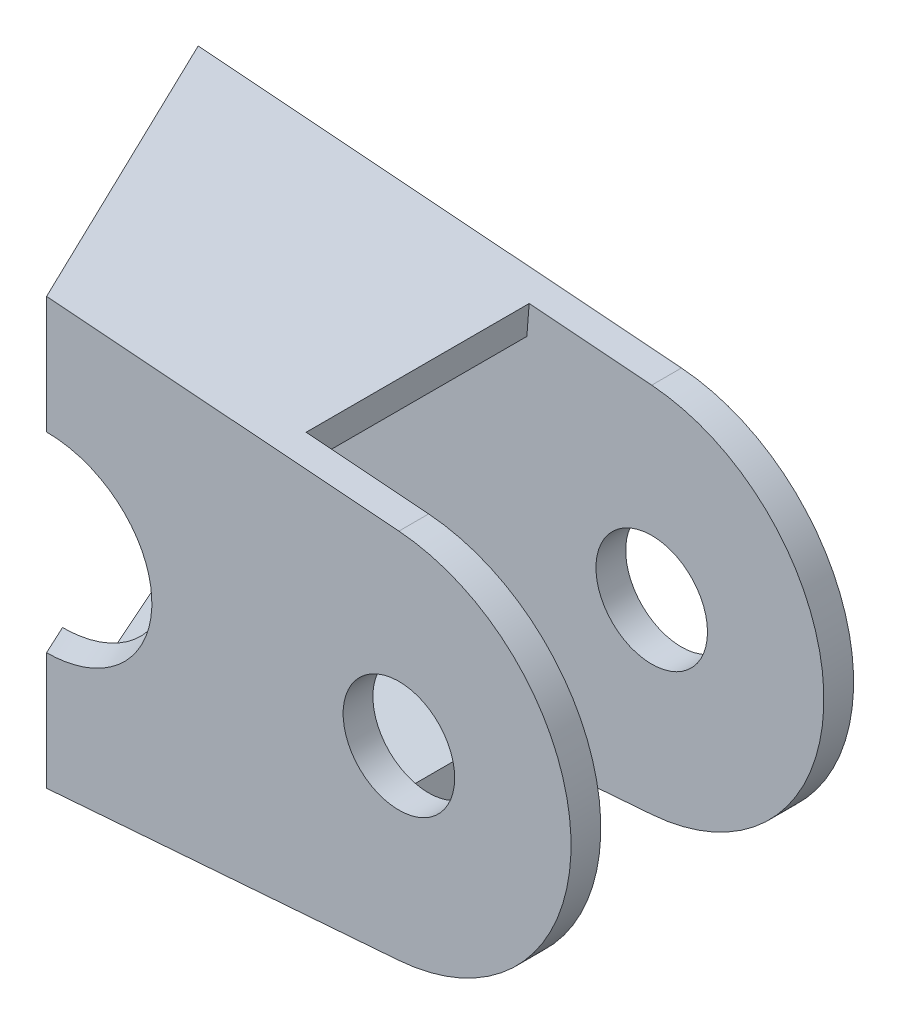
ISO-10303-21;
HEADER;
FILE_DESCRIPTION(('STEP AP214'),'2;1');
FILE_NAME('part.step','',(''),(''),'','','');
FILE_SCHEMA(('AUTOMOTIVE_DESIGN { 1 0 10303 214 1 1 1 1 }'));
ENDSEC;
DATA;
#1=APPLICATION_CONTEXT('core data for automotive mechanical design processes');
#2=APPLICATION_PROTOCOL_DEFINITION('international standard','automotive_design',2000,#1);
#3=PRODUCT_CONTEXT('',#1,'mechanical');
#4=PRODUCT('Part','Part','',(#3));
#5=PRODUCT_RELATED_PRODUCT_CATEGORY('part','',(#4));
#6=PRODUCT_DEFINITION_FORMATION('','',#4);
#7=PRODUCT_DEFINITION_CONTEXT('part definition',#1,'design');
#8=PRODUCT_DEFINITION('design','',#6,#7);
#9=PRODUCT_DEFINITION_SHAPE('','',#8);
#10=(LENGTH_UNIT() NAMED_UNIT(*) SI_UNIT(.MILLI.,.METRE.));
#11=(NAMED_UNIT(*) PLANE_ANGLE_UNIT() SI_UNIT($,.RADIAN.));
#12=(NAMED_UNIT(*) SI_UNIT($,.STERADIAN.) SOLID_ANGLE_UNIT());
#13=UNCERTAINTY_MEASURE_WITH_UNIT(LENGTH_MEASURE(1.E-05),#10,'distance_accuracy_value','');
#14=(GEOMETRIC_REPRESENTATION_CONTEXT(3) GLOBAL_UNCERTAINTY_ASSIGNED_CONTEXT((#13)) GLOBAL_UNIT_ASSIGNED_CONTEXT((#10,
#11,#12)) REPRESENTATION_CONTEXT('',''));
#15=CARTESIAN_POINT('',(0.,0.,0.));
#16=DIRECTION('',(0.,0.,1.));
#17=DIRECTION('',(1.,0.,0.));
#18=AXIS2_PLACEMENT_3D('',#15,#16,#17);
#19=CARTESIAN_POINT('',(-1.92307692307692,0.,15.));
#20=DIRECTION('',(0.,0.,-1.));
#21=DIRECTION('',(-1.,0.,0.));
#22=AXIS2_PLACEMENT_3D('',#19,#20,#21);
#23=PLANE('',#22);
#24=CARTESIAN_POINT('',(0.,0.,15.));
#25=DIRECTION('',(0.,0.,1.));
#26=DIRECTION('',(1.,0.,0.));
#27=AXIS2_PLACEMENT_3D('',#24,#25,#26);
#28=CIRCLE('',#27,7.5);
#29=CARTESIAN_POINT('',(7.5,0.,15.));
#30=VERTEX_POINT('',#29);
#31=EDGE_CURVE('E377',#30,#30,#28,.T.);
#32=ORIENTED_EDGE('',*,*,#31,.T.);
#33=EDGE_LOOP('',(#32));
#34=FACE_BOUND('',#33,.T.);
#35=DIRECTION('',(0.997054485501581,0.0766964988847371,0.));
#36=VECTOR('',#35,1.);
#37=CARTESIAN_POINT('',(-65.,-30.,15.));
#38=LINE('',#37,#36);
#39=CARTESIAN_POINT('',(-16.4838813032078,-26.2679908694775,15.));
#40=VERTEX_POINT('',#39);
#41=CARTESIAN_POINT('',(0.,-25.,15.));
#42=VERTEX_POINT('',#41);
#43=EDGE_CURVE('E395',#40,#42,#38,.T.);
#44=ORIENTED_EDGE('',*,*,#43,.F.);
#45=DIRECTION('',(0.0766964988847369,-0.997054485501582,0.));
#46=VECTOR('',#45,1.);
#47=CARTESIAN_POINT('',(-16.7906672987468,-22.2797729274712,15.));
#48=LINE('',#47,#46);
#49=CARTESIAN_POINT('',(-16.7906672987468,-22.2797729274712,15.));
#50=VERTEX_POINT('',#49);
#51=EDGE_CURVE('E242',#50,#40,#48,.T.);
#52=ORIENTED_EDGE('',*,*,#51,.F.);
#53=DIRECTION('',(0.997054485501582,0.0766964988847369,0.));
#54=VECTOR('',#53,1.);
#55=CARTESIAN_POINT('',(-49.5461443828369,-24.7994250108627,15.));
#56=LINE('',#55,#54);
#57=CARTESIAN_POINT('',(-49.2393583872979,-24.775826088129,15.));
#58=VERTEX_POINT('',#57);
#59=EDGE_CURVE('E231',#58,#50,#56,.T.);
#60=ORIENTED_EDGE('',*,*,#59,.F.);
#61=DIRECTION('',(0.,-1.,0.));
#62=VECTOR('',#61,1.);
#63=CARTESIAN_POINT('',(-49.2393583872979,0.,15.));
#64=LINE('',#63,#62);
#65=CARTESIAN_POINT('',(-49.2393583872979,-12.85,15.));
#66=VERTEX_POINT('',#65);
#67=EDGE_CURVE('E359',#66,#58,#64,.T.);
#68=ORIENTED_EDGE('',*,*,#67,.F.);
#69=CARTESIAN_POINT('',(-49.2393583872979,0.,15.));
#70=DIRECTION('',(0.,0.,-1.));
#71=DIRECTION('',(-1.,0.,0.));
#72=AXIS2_PLACEMENT_3D('',#69,#70,#71);
#73=ELLIPSE('',#72,14.1634575281908,12.85);
#74=CARTESIAN_POINT('',(-49.2393583872979,12.85,15.));
#75=VERTEX_POINT('',#74);
#76=EDGE_CURVE('E93',#66,#75,#73,.F.);
#77=ORIENTED_EDGE('',*,*,#76,.T.);
#78=DIRECTION('',(0.,-1.,0.));
#79=VECTOR('',#78,1.);
#80=CARTESIAN_POINT('',(-49.2393583872979,0.,15.));
#81=LINE('',#80,#79);
#82=CARTESIAN_POINT('',(-49.2393583872979,24.775826088129,15.));
#83=VERTEX_POINT('',#82);
#84=EDGE_CURVE('E366',#83,#75,#81,.T.);
#85=ORIENTED_EDGE('',*,*,#84,.F.);
#86=DIRECTION('',(0.997054485501582,-0.0766964988847369,0.));
#87=VECTOR('',#86,1.);
#88=CARTESIAN_POINT('',(-49.5461443828369,24.7994250108627,15.));
#89=LINE('',#88,#87);
#90=CARTESIAN_POINT('',(-16.7906672987468,22.2797729274712,15.));
#91=VERTEX_POINT('',#90);
#92=EDGE_CURVE('E98',#83,#91,#89,.T.);
#93=ORIENTED_EDGE('',*,*,#92,.T.);
#94=DIRECTION('',(0.0766964988847369,0.997054485501582,0.));
#95=VECTOR('',#94,1.);
#96=CARTESIAN_POINT('',(-16.7906672987468,22.2797729274712,15.));
#97=LINE('',#96,#95);
#98=CARTESIAN_POINT('',(-16.4838813032078,26.2679908694775,15.));
#99=VERTEX_POINT('',#98);
#100=EDGE_CURVE('E345',#91,#99,#97,.T.);
#101=ORIENTED_EDGE('',*,*,#100,.T.);
#102=DIRECTION('',(-0.997054485501581,0.0766964988847369,0.));
#103=VECTOR('',#102,1.);
#104=CARTESIAN_POINT('',(-65.,30.,15.));
#105=LINE('',#104,#103);
#106=CARTESIAN_POINT('',(0.,25.,15.));
#107=VERTEX_POINT('',#106);
#108=EDGE_CURVE('E381',#107,#99,#105,.T.);
#109=ORIENTED_EDGE('',*,*,#108,.F.);
#110=CARTESIAN_POINT('',(-1.92307692307692,0.,15.));
#111=DIRECTION('',(0.,0.,1.));
#112=DIRECTION('',(-1.,0.,0.));
#113=AXIS2_PLACEMENT_3D('',#110,#111,#112);
#114=CIRCLE('',#113,25.0738554046256);
#115=EDGE_CURVE('E388',#42,#107,#114,.T.);
#116=ORIENTED_EDGE('',*,*,#115,.F.);
#117=EDGE_LOOP('',(#44,#52,#60,#68,#77,#85,#93,#101,#109,#116));
#118=FACE_BOUND('',#117,.T.);
#119=ADVANCED_FACE('F89',(#34,#118),#23,.T.);
#120=CARTESIAN_POINT('',(-1.92307692307692,0.,-15.));
#121=DIRECTION('',(0.,0.,1.));
#122=DIRECTION('',(-1.,0.,0.));
#123=AXIS2_PLACEMENT_3D('',#120,#121,#122);
#124=PLANE('',#123);
#125=CARTESIAN_POINT('',(0.,0.,-15.));
#126=DIRECTION('',(0.,0.,1.));
#127=DIRECTION('',(1.,0.,0.));
#128=AXIS2_PLACEMENT_3D('',#125,#126,#127);
#129=CIRCLE('',#128,7.5);
#130=CARTESIAN_POINT('',(7.5,0.,-15.));
#131=VERTEX_POINT('',#130);
#132=EDGE_CURVE('E289',#131,#131,#129,.T.);
#133=ORIENTED_EDGE('',*,*,#132,.F.);
#134=EDGE_LOOP('',(#133));
#135=FACE_BOUND('',#134,.T.);
#136=DIRECTION('',(-0.997054485501581,-0.0766964988847369,0.));
#137=VECTOR('',#136,1.);
#138=CARTESIAN_POINT('',(-16.7906672987468,-22.2797729274712,-15.));
#139=LINE('',#138,#137);
#140=CARTESIAN_POINT('',(-16.7906672987468,-22.2797729274712,-15.));
#141=VERTEX_POINT('',#140);
#142=CARTESIAN_POINT('',(-63.1458068690939,-25.845552894421,-15.));
#143=VERTEX_POINT('',#142);
#144=EDGE_CURVE('E107',#141,#143,#139,.T.);
#145=ORIENTED_EDGE('',*,*,#144,.F.);
#146=DIRECTION('',(0.0766964988847369,-0.997054485501582,0.));
#147=VECTOR('',#146,1.);
#148=CARTESIAN_POINT('',(-16.7906672987468,-22.2797729274712,-15.));
#149=LINE('',#148,#147);
#150=CARTESIAN_POINT('',(-16.4838813032078,-26.2679908694775,-15.));
#151=VERTEX_POINT('',#150);
#152=EDGE_CURVE('E236',#141,#151,#149,.T.);
#153=ORIENTED_EDGE('',*,*,#152,.T.);
#154=DIRECTION('',(0.997054485501581,0.0766964988847371,0.));
#155=VECTOR('',#154,1.);
#156=CARTESIAN_POINT('',(-65.,-30.,-15.));
#157=LINE('',#156,#155);
#158=CARTESIAN_POINT('',(0.,-25.,-15.));
#159=VERTEX_POINT('',#158);
#160=EDGE_CURVE('E311',#151,#159,#157,.T.);
#161=ORIENTED_EDGE('',*,*,#160,.T.);
#162=CARTESIAN_POINT('',(-1.92307692307692,0.,-15.));
#163=DIRECTION('',(0.,0.,1.));
#164=DIRECTION('',(-1.,0.,0.));
#165=AXIS2_PLACEMENT_3D('',#162,#163,#164);
#166=CIRCLE('',#165,25.0738554046256);
#167=CARTESIAN_POINT('',(0.,25.,-15.));
#168=VERTEX_POINT('',#167);
#169=EDGE_CURVE('E300',#159,#168,#166,.T.);
#170=ORIENTED_EDGE('',*,*,#169,.T.);
#171=DIRECTION('',(-0.997054485501581,0.0766964988847369,0.));
#172=VECTOR('',#171,1.);
#173=CARTESIAN_POINT('',(-65.,30.,-15.));
#174=LINE('',#173,#172);
#175=CARTESIAN_POINT('',(-16.4838813032078,26.2679908694775,-15.));
#176=VERTEX_POINT('',#175);
#177=EDGE_CURVE('E293',#168,#176,#174,.T.);
#178=ORIENTED_EDGE('',*,*,#177,.T.);
#179=DIRECTION('',(0.0766964988847369,0.997054485501582,0.));
#180=VECTOR('',#179,1.);
#181=CARTESIAN_POINT('',(-16.7906672987468,22.2797729274712,-15.));
#182=LINE('',#181,#180);
#183=CARTESIAN_POINT('',(-16.7906672987468,22.2797729274712,-15.));
#184=VERTEX_POINT('',#183);
#185=EDGE_CURVE('E342',#184,#176,#182,.T.);
#186=ORIENTED_EDGE('',*,*,#185,.F.);
#187=DIRECTION('',(-0.997054485501581,0.0766964988847369,0.));
#188=VECTOR('',#187,1.);
#189=CARTESIAN_POINT('',(-16.7906672987468,22.2797729274712,-15.));
#190=LINE('',#189,#188);
#191=CARTESIAN_POINT('',(-63.1458068690939,25.845552894421,-15.));
#192=VERTEX_POINT('',#191);
#193=EDGE_CURVE('E323',#184,#192,#190,.T.);
#194=ORIENTED_EDGE('',*,*,#193,.T.);
#195=DIRECTION('',(0.,1.,0.));
#196=VECTOR('',#195,1.);
#197=CARTESIAN_POINT('',(-63.1458068690939,0.,-15.));
#198=LINE('',#197,#196);
#199=CARTESIAN_POINT('',(-63.1458068690939,12.85,-15.));
#200=VERTEX_POINT('',#199);
#201=EDGE_CURVE('E100',#200,#192,#198,.T.);
#202=ORIENTED_EDGE('',*,*,#201,.F.);
#203=CARTESIAN_POINT('',(-63.1458068690939,0.,-15.));
#204=DIRECTION('',(0.,0.,1.));
#205=DIRECTION('',(-1.,0.,0.));
#206=AXIS2_PLACEMENT_3D('',#203,#204,#205);
#207=ELLIPSE('',#206,14.1634575281908,12.85);
#208=CARTESIAN_POINT('',(-63.1458068690939,-12.85,-15.));
#209=VERTEX_POINT('',#208);
#210=EDGE_CURVE('E285',#200,#209,#207,.F.);
#211=ORIENTED_EDGE('',*,*,#210,.T.);
#212=DIRECTION('',(0.,1.,0.));
#213=VECTOR('',#212,1.);
#214=CARTESIAN_POINT('',(-63.1458068690939,0.,-15.));
#215=LINE('',#214,#213);
#216=EDGE_CURVE('E248',#143,#209,#215,.T.);
#217=ORIENTED_EDGE('',*,*,#216,.F.);
#218=EDGE_LOOP('',(#145,#153,#161,#170,#178,#186,#194,#202,#211,#217));
#219=FACE_BOUND('',#218,.T.);
#220=ADVANCED_FACE('F246',(#135,#219),#124,.T.);
#221=CARTESIAN_POINT('',(-1.92307692307692,0.,19.));
#222=DIRECTION('',(0.,0.,-1.));
#223=DIRECTION('',(-1.,0.,0.));
#224=AXIS2_PLACEMENT_3D('',#221,#222,#223);
#225=PLANE('',#224);
#226=CARTESIAN_POINT('',(-47.3851652563918,0.,19.));
#227=DIRECTION('',(0.,0.,-1.));
#228=DIRECTION('',(-1.,0.,0.));
#229=AXIS2_PLACEMENT_3D('',#226,#227,#228);
#230=ELLIPSE('',#229,14.1634575281908,12.85);
#231=CARTESIAN_POINT('',(-47.3851652563918,-12.85,19.));
#232=VERTEX_POINT('',#231);
#233=CARTESIAN_POINT('',(-47.3851652563918,12.85,19.));
#234=VERTEX_POINT('',#233);
#235=EDGE_CURVE('E375',#232,#234,#230,.F.);
#236=ORIENTED_EDGE('',*,*,#235,.F.);
#237=DIRECTION('',(0.,-1.,0.));
#238=VECTOR('',#237,1.);
#239=CARTESIAN_POINT('',(-47.3851652563918,0.,19.));
#240=LINE('',#239,#238);
#241=CARTESIAN_POINT('',(-47.3851652563918,-28.6450127120301,19.));
#242=VERTEX_POINT('',#241);
#243=EDGE_CURVE('E362',#232,#242,#240,.T.);
#244=ORIENTED_EDGE('',*,*,#243,.T.);
#245=DIRECTION('',(0.997054485501581,0.0766964988847371,0.));
#246=VECTOR('',#245,1.);
#247=CARTESIAN_POINT('',(-65.,-30.,19.));
#248=LINE('',#247,#246);
#249=CARTESIAN_POINT('',(0.,-25.,19.));
#250=VERTEX_POINT('',#249);
#251=EDGE_CURVE('E387',#242,#250,#248,.T.);
#252=ORIENTED_EDGE('',*,*,#251,.T.);
#253=CARTESIAN_POINT('',(-1.92307692307692,0.,19.));
#254=DIRECTION('',(0.,0.,1.));
#255=DIRECTION('',(-1.,0.,0.));
#256=AXIS2_PLACEMENT_3D('',#253,#254,#255);
#257=CIRCLE('',#256,25.0738554046256);
#258=CARTESIAN_POINT('',(0.,25.,19.));
#259=VERTEX_POINT('',#258);
#260=EDGE_CURVE('E390',#250,#259,#257,.T.);
#261=ORIENTED_EDGE('',*,*,#260,.T.);
#262=DIRECTION('',(-0.997054485501581,0.0766964988847369,0.));
#263=VECTOR('',#262,1.);
#264=CARTESIAN_POINT('',(-65.,30.,19.));
#265=LINE('',#264,#263);
#266=CARTESIAN_POINT('',(-47.3851652563918,28.6450127120301,19.));
#267=VERTEX_POINT('',#266);
#268=EDGE_CURVE('E384',#259,#267,#265,.T.);
#269=ORIENTED_EDGE('',*,*,#268,.T.);
#270=DIRECTION('',(0.,-1.,0.));
#271=VECTOR('',#270,1.);
#272=CARTESIAN_POINT('',(-47.3851652563918,0.,19.));
#273=LINE('',#272,#271);
#274=EDGE_CURVE('E372',#267,#234,#273,.T.);
#275=ORIENTED_EDGE('',*,*,#274,.T.);
#276=EDGE_LOOP('',(#236,#244,#252,#261,#269,#275));
#277=FACE_BOUND('',#276,.T.);
#278=CARTESIAN_POINT('',(0.,0.,19.));
#279=DIRECTION('',(0.,0.,1.));
#280=DIRECTION('',(1.,0.,0.));
#281=AXIS2_PLACEMENT_3D('',#278,#279,#280);
#282=CIRCLE('',#281,7.5);
#283=CARTESIAN_POINT('',(7.5,0.,19.));
#284=VERTEX_POINT('',#283);
#285=EDGE_CURVE('E378',#284,#284,#282,.T.);
#286=ORIENTED_EDGE('',*,*,#285,.F.);
#287=EDGE_LOOP('',(#286));
#288=FACE_BOUND('',#287,.T.);
#289=ADVANCED_FACE('F432',(#277,#288),#225,.F.);
#290=CARTESIAN_POINT('',(-65.,30.,19.));
#291=DIRECTION('',(-0.0766964988847369,-0.997054485501582,0.));
#292=DIRECTION('',(0.997054485501582,-0.0766964988847369,0.));
#293=AXIS2_PLACEMENT_3D('',#290,#291,#292);
#294=PLANE('',#293);
#295=ORIENTED_EDGE('',*,*,#108,.T.);
#296=DIRECTION('',(0.,0.,-1.));
#297=VECTOR('',#296,1.);
#298=CARTESIAN_POINT('',(-16.4838813032078,26.2679908694775,15.));
#299=LINE('',#298,#297);
#300=EDGE_CURVE('E339',#99,#176,#299,.T.);
#301=ORIENTED_EDGE('',*,*,#300,.T.);
#302=ORIENTED_EDGE('',*,*,#177,.F.);
#303=DIRECTION('',(0.,0.,1.));
#304=VECTOR('',#303,1.);
#305=CARTESIAN_POINT('',(0.,25.,-19.));
#306=LINE('',#305,#304);
#307=CARTESIAN_POINT('',(0.,25.,-19.));
#308=VERTEX_POINT('',#307);
#309=EDGE_CURVE('E308',#308,#168,#306,.T.);
#310=ORIENTED_EDGE('',*,*,#309,.F.);
#311=DIRECTION('',(-0.997054485501581,0.0766964988847369,0.));
#312=VECTOR('',#311,1.);
#313=CARTESIAN_POINT('',(-65.,30.,-19.));
#314=LINE('',#313,#312);
#315=CARTESIAN_POINT('',(-65.,30.,-19.));
#316=VERTEX_POINT('',#315);
#317=EDGE_CURVE('E296',#308,#316,#314,.T.);
#318=ORIENTED_EDGE('',*,*,#317,.T.);
#319=DIRECTION('',(0.420340926614704,-0.0323339174319002,0.906789955390001));
#320=VECTOR('',#319,1.);
#321=CARTESIAN_POINT('',(-65.,30.,-19.));
#322=LINE('',#321,#320);
#323=CARTESIAN_POINT('',(-63.1458068690939,29.8573697591611,-15.));
#324=VERTEX_POINT('',#323);
#325=EDGE_CURVE('E279',#316,#324,#322,.T.);
#326=ORIENTED_EDGE('',*,*,#325,.T.);
#327=DIRECTION('',(0.420340926614704,-0.0323339174319003,0.906789955390001));
#328=VECTOR('',#327,1.);
#329=CARTESIAN_POINT('',(-63.1458068690939,29.8573697591611,-15.));
#330=LINE('',#329,#328);
#331=CARTESIAN_POINT('',(-49.239358387298,28.7876429528691,15.));
#332=VERTEX_POINT('',#331);
#333=EDGE_CURVE('E322',#324,#332,#330,.T.);
#334=ORIENTED_EDGE('',*,*,#333,.T.);
#335=DIRECTION('',(0.420340926614704,-0.0323339174319002,0.906789955390001));
#336=VECTOR('',#335,1.);
#337=CARTESIAN_POINT('',(-50.5158846564456,28.885837281265,12.2461848814556));
#338=LINE('',#337,#336);
#339=EDGE_CURVE('E405',#332,#267,#338,.T.);
#340=ORIENTED_EDGE('',*,*,#339,.T.);
#341=ORIENTED_EDGE('',*,*,#268,.F.);
#342=DIRECTION('',(0.,0.,-1.));
#343=VECTOR('',#342,1.);
#344=CARTESIAN_POINT('',(0.,25.,19.));
#345=LINE('',#344,#343);
#346=EDGE_CURVE('E392',#259,#107,#345,.T.);
#347=ORIENTED_EDGE('',*,*,#346,.T.);
#348=EDGE_LOOP('',(#295,#301,#302,#310,#318,#326,#334,#340,#341,#347));
#349=FACE_BOUND('',#348,.T.);
#350=ADVANCED_FACE('F91',(#349),#294,.F.);
#351=CARTESIAN_POINT('',(-65.,-30.,19.));
#352=DIRECTION('',(-0.0766964988847371,0.997054485501582,0.));
#353=DIRECTION('',(-0.997054485501582,-0.0766964988847371,0.));
#354=AXIS2_PLACEMENT_3D('',#351,#352,#353);
#355=PLANE('',#354);
#356=ORIENTED_EDGE('',*,*,#251,.F.);
#357=DIRECTION('',(-0.420340926614704,-0.0323339174319003,-0.906789955390001));
#358=VECTOR('',#357,1.);
#359=CARTESIAN_POINT('',(-50.5158846564456,-28.885837281265,12.2461848814556));
#360=LINE('',#359,#358);
#361=CARTESIAN_POINT('',(-49.2393583872979,-28.7876429528691,15.));
#362=VERTEX_POINT('',#361);
#363=EDGE_CURVE('E403',#242,#362,#360,.T.);
#364=ORIENTED_EDGE('',*,*,#363,.T.);
#365=DIRECTION('',(0.420340926614704,0.0323339174319003,0.906789955390001));
#366=VECTOR('',#365,1.);
#367=CARTESIAN_POINT('',(-63.1458068690939,-29.8573697591611,-15.));
#368=LINE('',#367,#366);
#369=CARTESIAN_POINT('',(-63.1458068690939,-29.8573697591611,-15.));
#370=VERTEX_POINT('',#369);
#371=EDGE_CURVE('E252',#370,#362,#368,.T.);
#372=ORIENTED_EDGE('',*,*,#371,.F.);
#373=DIRECTION('',(-0.420340926614704,-0.0323339174319003,-0.906789955390001));
#374=VECTOR('',#373,1.);
#375=CARTESIAN_POINT('',(-65.,-30.,-19.));
#376=LINE('',#375,#374);
#377=CARTESIAN_POINT('',(-65.,-30.,-19.));
#378=VERTEX_POINT('',#377);
#379=EDGE_CURVE('E319',#370,#378,#376,.T.);
#380=ORIENTED_EDGE('',*,*,#379,.T.);
#381=DIRECTION('',(0.997054485501581,0.0766964988847371,0.));
#382=VECTOR('',#381,1.);
#383=CARTESIAN_POINT('',(-65.,-30.,-19.));
#384=LINE('',#383,#382);
#385=CARTESIAN_POINT('',(0.,-25.,-19.));
#386=VERTEX_POINT('',#385);
#387=EDGE_CURVE('E302',#378,#386,#384,.T.);
#388=ORIENTED_EDGE('',*,*,#387,.T.);
#389=DIRECTION('',(0.,0.,1.));
#390=VECTOR('',#389,1.);
#391=CARTESIAN_POINT('',(0.,-25.,-19.));
#392=LINE('',#391,#390);
#393=EDGE_CURVE('E316',#386,#159,#392,.T.);
#394=ORIENTED_EDGE('',*,*,#393,.T.);
#395=ORIENTED_EDGE('',*,*,#160,.F.);
#396=DIRECTION('',(0.,0.,-1.));
#397=VECTOR('',#396,1.);
#398=CARTESIAN_POINT('',(-16.4838813032078,-26.2679908694775,15.));
#399=LINE('',#398,#397);
#400=EDGE_CURVE('E239',#40,#151,#399,.T.);
#401=ORIENTED_EDGE('',*,*,#400,.F.);
#402=ORIENTED_EDGE('',*,*,#43,.T.);
#403=DIRECTION('',(0.,0.,-1.));
#404=VECTOR('',#403,1.);
#405=CARTESIAN_POINT('',(0.,-25.,19.));
#406=LINE('',#405,#404);
#407=EDGE_CURVE('E400',#250,#42,#406,.T.);
#408=ORIENTED_EDGE('',*,*,#407,.F.);
#409=EDGE_LOOP('',(#356,#364,#372,#380,#388,#394,#395,#401,#402,#408));
#410=FACE_BOUND('',#409,.T.);
#411=ADVANCED_FACE('F442',(#410),#355,.F.);
#412=CARTESIAN_POINT('',(-1.92307692307692,0.,19.));
#413=DIRECTION('',(0.,0.,-1.));
#414=DIRECTION('',(-1.,0.,0.));
#415=AXIS2_PLACEMENT_3D('',#412,#413,#414);
#416=CYLINDRICAL_SURFACE('',#415,25.0738554046256);
#417=ORIENTED_EDGE('',*,*,#115,.T.);
#418=ORIENTED_EDGE('',*,*,#346,.F.);
#419=ORIENTED_EDGE('',*,*,#260,.F.);
#420=ORIENTED_EDGE('',*,*,#407,.T.);
#421=EDGE_LOOP('',(#417,#418,#419,#420));
#422=FACE_BOUND('',#421,.T.);
#423=ADVANCED_FACE('F438',(#422),#416,.T.);
#424=CARTESIAN_POINT('',(0.,0.,19.));
#425=DIRECTION('',(0.,0.,-1.));
#426=DIRECTION('',(-1.,0.,0.));
#427=AXIS2_PLACEMENT_3D('',#424,#425,#426);
#428=CYLINDRICAL_SURFACE('',#427,7.5);
#429=ORIENTED_EDGE('',*,*,#285,.T.);
#430=EDGE_LOOP('',(#429));
#431=FACE_BOUND('',#430,.T.);
#432=ORIENTED_EDGE('',*,*,#31,.F.);
#433=EDGE_LOOP('',(#432));
#434=FACE_BOUND('',#433,.T.);
#435=ADVANCED_FACE('F484',(#431,#434),#428,.F.);
#436=CARTESIAN_POINT('',(-40.4408668581856,0.,33.9807445243043));
#437=DIRECTION('',(-0.420560828539217,0.,-0.907264343782124));
#438=DIRECTION('',(-0.907264343782124,0.,0.420560828539217));
#439=AXIS2_PLACEMENT_3D('',#436,#437,#438);
#440=CYLINDRICAL_SURFACE('',#439,12.85);
#441=ORIENTED_EDGE('',*,*,#235,.T.);
#442=DIRECTION('',(-0.420560828539217,0.,-0.907264343782124));
#443=VECTOR('',#442,1.);
#444=CARTESIAN_POINT('',(-40.4408668581856,12.85,33.9807445243043));
#445=LINE('',#444,#443);
#446=EDGE_CURVE('E358',#234,#75,#445,.T.);
#447=ORIENTED_EDGE('',*,*,#446,.T.);
#448=ORIENTED_EDGE('',*,*,#76,.F.);
#449=DIRECTION('',(-0.420560828539217,0.,-0.907264343782124));
#450=VECTOR('',#449,1.);
#451=CARTESIAN_POINT('',(-40.4408668581856,-12.85,33.9807445243043));
#452=LINE('',#451,#450);
#453=EDGE_CURVE('E344',#232,#66,#452,.T.);
#454=ORIENTED_EDGE('',*,*,#453,.F.);
#455=EDGE_LOOP('',(#441,#447,#448,#454));
#456=FACE_BOUND('',#455,.T.);
#457=ADVANCED_FACE('F482',(#456),#440,.F.);
#458=CARTESIAN_POINT('',(-40.4408668581856,30.3168261093561,33.9807445243043));
#459=DIRECTION('',(0.907264343782124,0.,-0.420560828539217));
#460=DIRECTION('',(-0.420560828539217,0.,-0.907264343782124));
#461=AXIS2_PLACEMENT_3D('',#458,#459,#460);
#462=PLANE('',#461);
#463=ORIENTED_EDGE('',*,*,#339,.F.);
#464=EDGE_CURVE('E369',#332,#83,#81,.T.);
#465=ORIENTED_EDGE('',*,*,#464,.T.);
#466=ORIENTED_EDGE('',*,*,#84,.T.);
#467=ORIENTED_EDGE('',*,*,#446,.F.);
#468=ORIENTED_EDGE('',*,*,#274,.F.);
#469=EDGE_LOOP('',(#463,#465,#466,#467,#468));
#470=FACE_BOUND('',#469,.T.);
#471=ADVANCED_FACE('F428',(#470),#462,.F.);
#472=CARTESIAN_POINT('',(-40.4408668581856,-12.85,33.9807445243043));
#473=DIRECTION('',(0.907264343782124,0.,-0.420560828539217));
#474=DIRECTION('',(-0.420560828539217,0.,-0.907264343782124));
#475=AXIS2_PLACEMENT_3D('',#472,#473,#474);
#476=PLANE('',#475);
#477=ORIENTED_EDGE('',*,*,#453,.T.);
#478=ORIENTED_EDGE('',*,*,#67,.T.);
#479=EDGE_CURVE('E363',#58,#362,#64,.T.);
#480=ORIENTED_EDGE('',*,*,#479,.T.);
#481=ORIENTED_EDGE('',*,*,#363,.F.);
#482=ORIENTED_EDGE('',*,*,#243,.F.);
#483=EDGE_LOOP('',(#477,#478,#480,#481,#482));
#484=FACE_BOUND('',#483,.T.);
#485=ADVANCED_FACE('F479',(#484),#476,.F.);
#486=CARTESIAN_POINT('',(-49.5461443828369,24.7994250108627,15.));
#487=DIRECTION('',(0.,0.,1.));
#488=DIRECTION('',(1.,0.,0.));
#489=AXIS2_PLACEMENT_3D('',#486,#487,#488);
#490=PLANE('',#489);
#491=ORIENTED_EDGE('',*,*,#464,.F.);
#492=DIRECTION('',(0.0766964988847369,0.997054485501582,0.));
#493=VECTOR('',#492,1.);
#494=CARTESIAN_POINT('',(-49.5461443828369,24.7994250108627,15.));
#495=LINE('',#494,#493);
#496=CARTESIAN_POINT('',(-49.5461443828369,24.7994250108627,15.));
#497=VERTEX_POINT('',#496);
#498=EDGE_CURVE('E348',#497,#332,#495,.T.);
#499=ORIENTED_EDGE('',*,*,#498,.F.);
#500=EDGE_CURVE('E330',#497,#83,#89,.T.);
#501=ORIENTED_EDGE('',*,*,#500,.T.);
#502=EDGE_LOOP('',(#491,#499,#501));
#503=FACE_BOUND('',#502,.T.);
#504=ADVANCED_FACE('F423',(#503),#490,.T.);
#505=CARTESIAN_POINT('',(-16.7906672987468,22.2797729274712,-15.));
#506=DIRECTION('',(0.,0.,-1.));
#507=DIRECTION('',(-1.,0.,0.));
#508=AXIS2_PLACEMENT_3D('',#505,#506,#507);
#509=PLANE('',#508);
#510=EDGE_CURVE('E13',#192,#324,#198,.T.);
#511=ORIENTED_EDGE('',*,*,#510,.F.);
#512=CARTESIAN_POINT('',(-63.4525928646329,25.8691518171547,-15.));
#513=VERTEX_POINT('',#512);
#514=EDGE_CURVE('E327',#192,#513,#190,.T.);
#515=ORIENTED_EDGE('',*,*,#514,.T.);
#516=DIRECTION('',(0.0766964988847369,0.997054485501582,0.));
#517=VECTOR('',#516,1.);
#518=CARTESIAN_POINT('',(-63.4525928646329,25.8691518171547,-15.));
#519=LINE('',#518,#517);
#520=EDGE_CURVE('E336',#513,#324,#519,.T.);
#521=ORIENTED_EDGE('',*,*,#520,.T.);
#522=EDGE_LOOP('',(#511,#515,#521));
#523=FACE_BOUND('',#522,.T.);
#524=ADVANCED_FACE('F613',(#523),#509,.T.);
#525=CARTESIAN_POINT('',(-16.7906672987468,22.2797729274712,15.));
#526=DIRECTION('',(0.997054485501582,-0.0766964988847369,0.));
#527=DIRECTION('',(0.0766964988847369,0.997054485501582,0.));
#528=AXIS2_PLACEMENT_3D('',#525,#526,#527);
#529=PLANE('',#528);
#530=ORIENTED_EDGE('',*,*,#300,.F.);
#531=ORIENTED_EDGE('',*,*,#100,.F.);
#532=DIRECTION('',(0.,0.,-1.));
#533=VECTOR('',#532,1.);
#534=CARTESIAN_POINT('',(-16.7906672987468,22.2797729274712,15.));
#535=LINE('',#534,#533);
#536=EDGE_CURVE('E333',#91,#184,#535,.T.);
#537=ORIENTED_EDGE('',*,*,#536,.T.);
#538=ORIENTED_EDGE('',*,*,#185,.T.);
#539=EDGE_LOOP('',(#530,#531,#537,#538));
#540=FACE_BOUND('',#539,.T.);
#541=ADVANCED_FACE('F448',(#540),#529,.T.);
#542=CARTESIAN_POINT('',(-63.4525928646329,25.8691518171547,-15.));
#543=DIRECTION('',(-0.904118992429379,0.0695476148022598,0.421582704583336));
#544=DIRECTION('',(0.422605988723963,0.,0.906313509937175));
#545=AXIS2_PLACEMENT_3D('',#542,#543,#544);
#546=PLANE('',#545);
#547=ORIENTED_EDGE('',*,*,#333,.F.);
#548=ORIENTED_EDGE('',*,*,#520,.F.);
#549=DIRECTION('',(0.420340926614704,-0.0323339174319003,0.906789955390001));
#550=VECTOR('',#549,1.);
#551=CARTESIAN_POINT('',(-63.4525928646329,25.8691518171547,-15.));
#552=LINE('',#551,#550);
#553=EDGE_CURVE('E326',#513,#497,#552,.T.);
#554=ORIENTED_EDGE('',*,*,#553,.T.);
#555=ORIENTED_EDGE('',*,*,#498,.T.);
#556=EDGE_LOOP('',(#547,#548,#554,#555));
#557=FACE_BOUND('',#556,.T.);
#558=ADVANCED_FACE('F425',(#557),#546,.T.);
#559=CARTESIAN_POINT('',(1.6049787103434,20.8647232344643,0.));
#560=DIRECTION('',(-0.0766964988847369,-0.997054485501582,0.));
#561=DIRECTION('',(0.997054485501582,-0.0766964988847369,0.));
#562=AXIS2_PLACEMENT_3D('',#559,#560,#561);
#563=PLANE('',#562);
#564=ORIENTED_EDGE('',*,*,#193,.F.);
#565=ORIENTED_EDGE('',*,*,#536,.F.);
#566=ORIENTED_EDGE('',*,*,#92,.F.);
#567=ORIENTED_EDGE('',*,*,#500,.F.);
#568=ORIENTED_EDGE('',*,*,#553,.F.);
#569=ORIENTED_EDGE('',*,*,#514,.F.);
#570=EDGE_LOOP('',(#564,#565,#566,#567,#568,#569));
#571=FACE_BOUND('',#570,.T.);
#572=ADVANCED_FACE('F420',(#571),#563,.T.);
#573=CARTESIAN_POINT('',(-1.92307692307692,0.,-19.));
#574=DIRECTION('',(0.,0.,1.));
#575=DIRECTION('',(-1.,0.,0.));
#576=AXIS2_PLACEMENT_3D('',#573,#574,#575);
#577=PLANE('',#576);
#578=CARTESIAN_POINT('',(0.,0.,-19.));
#579=DIRECTION('',(0.,0.,1.));
#580=DIRECTION('',(1.,0.,0.));
#581=AXIS2_PLACEMENT_3D('',#578,#579,#580);
#582=CIRCLE('',#581,7.5);
#583=CARTESIAN_POINT('',(7.5,0.,-19.));
#584=VERTEX_POINT('',#583);
#585=EDGE_CURVE('E290',#584,#584,#582,.T.);
#586=ORIENTED_EDGE('',*,*,#585,.T.);
#587=EDGE_LOOP('',(#586));
#588=FACE_BOUND('',#587,.T.);
#589=CARTESIAN_POINT('',(-65.,0.,-19.));
#590=DIRECTION('',(0.,0.,1.));
#591=DIRECTION('',(-1.,0.,0.));
#592=AXIS2_PLACEMENT_3D('',#589,#590,#591);
#593=ELLIPSE('',#592,14.1634575281908,12.85);
#594=CARTESIAN_POINT('',(-65.,12.85,-18.9999999999999));
#595=VERTEX_POINT('',#594);
#596=CARTESIAN_POINT('',(-65.,-12.85,-18.9999999999999));
#597=VERTEX_POINT('',#596);
#598=EDGE_CURVE('E287',#595,#597,#593,.F.);
#599=ORIENTED_EDGE('',*,*,#598,.F.);
#600=DIRECTION('',(0.,-1.,0.));
#601=VECTOR('',#600,1.);
#602=CARTESIAN_POINT('',(-65.,30.,-19.));
#603=LINE('',#602,#601);
#604=EDGE_CURVE('E299',#316,#595,#603,.T.);
#605=ORIENTED_EDGE('',*,*,#604,.F.);
#606=ORIENTED_EDGE('',*,*,#317,.F.);
#607=CARTESIAN_POINT('',(-1.92307692307692,0.,-19.));
#608=DIRECTION('',(0.,0.,1.));
#609=DIRECTION('',(-1.,0.,0.));
#610=AXIS2_PLACEMENT_3D('',#607,#608,#609);
#611=CIRCLE('',#610,25.0738554046256);
#612=EDGE_CURVE('E305',#386,#308,#611,.T.);
#613=ORIENTED_EDGE('',*,*,#612,.F.);
#614=ORIENTED_EDGE('',*,*,#387,.F.);
#615=DIRECTION('',(0.,1.,0.));
#616=VECTOR('',#615,1.);
#617=CARTESIAN_POINT('',(-65.,30.,-19.));
#618=LINE('',#617,#616);
#619=EDGE_CURVE('E274',#378,#597,#618,.T.);
#620=ORIENTED_EDGE('',*,*,#619,.T.);
#621=EDGE_LOOP('',(#599,#605,#606,#613,#614,#620));
#622=FACE_BOUND('',#621,.T.);
#623=ADVANCED_FACE('F459',(#588,#622),#577,.F.);
#624=CARTESIAN_POINT('',(-1.92307692307692,0.,-19.));
#625=DIRECTION('',(0.,0.,1.));
#626=DIRECTION('',(-1.,0.,0.));
#627=AXIS2_PLACEMENT_3D('',#624,#625,#626);
#628=CYLINDRICAL_SURFACE('',#627,25.0738554046256);
#629=ORIENTED_EDGE('',*,*,#169,.F.);
#630=ORIENTED_EDGE('',*,*,#393,.F.);
#631=ORIENTED_EDGE('',*,*,#612,.T.);
#632=ORIENTED_EDGE('',*,*,#309,.T.);
#633=EDGE_LOOP('',(#629,#630,#631,#632));
#634=FACE_BOUND('',#633,.T.);
#635=ADVANCED_FACE('F561',(#634),#628,.T.);
#636=CARTESIAN_POINT('',(0.,0.,-19.));
#637=DIRECTION('',(0.,0.,1.));
#638=DIRECTION('',(-1.,0.,0.));
#639=AXIS2_PLACEMENT_3D('',#636,#637,#638);
#640=CYLINDRICAL_SURFACE('',#639,7.5);
#641=ORIENTED_EDGE('',*,*,#585,.F.);
#642=EDGE_LOOP('',(#641));
#643=FACE_BOUND('',#642,.T.);
#644=ORIENTED_EDGE('',*,*,#132,.T.);
#645=EDGE_LOOP('',(#644));
#646=FACE_BOUND('',#645,.T.);
#647=ADVANCED_FACE('F551',(#643,#646),#640,.F.);
#648=CARTESIAN_POINT('',(-40.4408668581856,0.,33.9807445243043));
#649=DIRECTION('',(-0.420560828539217,0.,-0.907264343782124));
#650=DIRECTION('',(-0.907264343782124,0.,0.420560828539217));
#651=AXIS2_PLACEMENT_3D('',#648,#649,#650);
#652=CYLINDRICAL_SURFACE('',#651,12.85);
#653=ORIENTED_EDGE('',*,*,#598,.T.);
#654=DIRECTION('',(-0.420560828539217,0.,-0.907264343782124));
#655=VECTOR('',#654,1.);
#656=CARTESIAN_POINT('',(-40.4408668581856,-12.85,33.9807445243043));
#657=LINE('',#656,#655);
#658=EDGE_CURVE('E263',#209,#597,#657,.T.);
#659=ORIENTED_EDGE('',*,*,#658,.F.);
#660=ORIENTED_EDGE('',*,*,#210,.F.);
#661=DIRECTION('',(-0.420560828539217,0.,-0.907264343782124));
#662=VECTOR('',#661,1.);
#663=CARTESIAN_POINT('',(-40.4408668581856,12.85,33.9807445243043));
#664=LINE('',#663,#662);
#665=EDGE_CURVE('E273',#200,#595,#664,.T.);
#666=ORIENTED_EDGE('',*,*,#665,.T.);
#667=EDGE_LOOP('',(#653,#659,#660,#666));
#668=FACE_BOUND('',#667,.T.);
#669=ADVANCED_FACE('F456',(#668),#652,.F.);
#670=CARTESIAN_POINT('',(-40.4408668581856,-12.85,33.9807445243043));
#671=DIRECTION('',(0.907264343782124,0.,-0.420560828539217));
#672=DIRECTION('',(-0.420560828539217,0.,-0.907264343782124));
#673=AXIS2_PLACEMENT_3D('',#670,#671,#672);
#674=PLANE('',#673);
#675=EDGE_CURVE('E277',#370,#143,#215,.T.);
#676=ORIENTED_EDGE('',*,*,#675,.T.);
#677=ORIENTED_EDGE('',*,*,#216,.T.);
#678=ORIENTED_EDGE('',*,*,#658,.T.);
#679=ORIENTED_EDGE('',*,*,#619,.F.);
#680=ORIENTED_EDGE('',*,*,#379,.F.);
#681=EDGE_LOOP('',(#676,#677,#678,#679,#680));
#682=FACE_BOUND('',#681,.T.);
#683=ADVANCED_FACE('F465',(#682),#674,.F.);
#684=CARTESIAN_POINT('',(-40.4408668581856,30.3168261093561,33.9807445243043));
#685=DIRECTION('',(0.907264343782124,0.,-0.420560828539217));
#686=DIRECTION('',(-0.420560828539217,0.,-0.907264343782124));
#687=AXIS2_PLACEMENT_3D('',#684,#685,#686);
#688=PLANE('',#687);
#689=ORIENTED_EDGE('',*,*,#201,.T.);
#690=ORIENTED_EDGE('',*,*,#510,.T.);
#691=ORIENTED_EDGE('',*,*,#325,.F.);
#692=ORIENTED_EDGE('',*,*,#604,.T.);
#693=ORIENTED_EDGE('',*,*,#665,.F.);
#694=EDGE_LOOP('',(#689,#690,#691,#692,#693));
#695=FACE_BOUND('',#694,.T.);
#696=ADVANCED_FACE('F452',(#695),#688,.F.);
#697=CARTESIAN_POINT('',(-49.5461443828369,-24.7994250108627,15.));
#698=DIRECTION('',(0.,0.,-1.));
#699=DIRECTION('',(-1.,0.,0.));
#700=AXIS2_PLACEMENT_3D('',#697,#698,#699);
#701=PLANE('',#700);
#702=DIRECTION('',(0.0766964988847369,-0.997054485501582,0.));
#703=VECTOR('',#702,1.);
#704=CARTESIAN_POINT('',(-49.5461443828369,-24.7994250108627,15.));
#705=LINE('',#704,#703);
#706=CARTESIAN_POINT('',(-49.5461443828369,-24.7994250108627,15.));
#707=VERTEX_POINT('',#706);
#708=EDGE_CURVE('E264',#707,#362,#705,.T.);
#709=ORIENTED_EDGE('',*,*,#708,.T.);
#710=ORIENTED_EDGE('',*,*,#479,.F.);
#711=EDGE_CURVE('E254',#707,#58,#56,.T.);
#712=ORIENTED_EDGE('',*,*,#711,.F.);
#713=EDGE_LOOP('',(#709,#710,#712));
#714=FACE_BOUND('',#713,.T.);
#715=ADVANCED_FACE('F477',(#714),#701,.F.);
#716=CARTESIAN_POINT('',(-16.7906672987468,-22.2797729274712,-15.));
#717=DIRECTION('',(0.,0.,1.));
#718=DIRECTION('',(1.,0.,0.));
#719=AXIS2_PLACEMENT_3D('',#716,#717,#718);
#720=PLANE('',#719);
#721=CARTESIAN_POINT('',(-63.4525928646329,-25.8691518171547,-15.));
#722=VERTEX_POINT('',#721);
#723=EDGE_CURVE('E250',#143,#722,#139,.T.);
#724=ORIENTED_EDGE('',*,*,#723,.F.);
#725=ORIENTED_EDGE('',*,*,#675,.F.);
#726=DIRECTION('',(0.0766964988847369,-0.997054485501582,0.));
#727=VECTOR('',#726,1.);
#728=CARTESIAN_POINT('',(-63.4525928646329,-25.8691518171547,-15.));
#729=LINE('',#728,#727);
#730=EDGE_CURVE('E260',#722,#370,#729,.T.);
#731=ORIENTED_EDGE('',*,*,#730,.F.);
#732=EDGE_LOOP('',(#724,#725,#731));
#733=FACE_BOUND('',#732,.T.);
#734=ADVANCED_FACE('F474',(#733),#720,.F.);
#735=CARTESIAN_POINT('',(-63.4525928646329,-25.8691518171547,-15.));
#736=DIRECTION('',(0.904118992429379,0.0695476148022598,-0.421582704583336));
#737=DIRECTION('',(-0.422605988723963,0.,-0.906313509937175));
#738=AXIS2_PLACEMENT_3D('',#735,#736,#737);
#739=PLANE('',#738);
#740=ORIENTED_EDGE('',*,*,#371,.T.);
#741=ORIENTED_EDGE('',*,*,#708,.F.);
#742=DIRECTION('',(0.420340926614704,0.0323339174319003,0.906789955390001));
#743=VECTOR('',#742,1.);
#744=CARTESIAN_POINT('',(-63.4525928646329,-25.8691518171547,-15.));
#745=LINE('',#744,#743);
#746=EDGE_CURVE('E243',#722,#707,#745,.T.);
#747=ORIENTED_EDGE('',*,*,#746,.F.);
#748=ORIENTED_EDGE('',*,*,#730,.T.);
#749=EDGE_LOOP('',(#740,#741,#747,#748));
#750=FACE_BOUND('',#749,.T.);
#751=ADVANCED_FACE('F472',(#750),#739,.F.);
#752=CARTESIAN_POINT('',(-16.7906672987468,-22.2797729274712,15.));
#753=DIRECTION('',(-0.997054485501582,-0.0766964988847369,0.));
#754=DIRECTION('',(0.0766964988847369,-0.997054485501582,0.));
#755=AXIS2_PLACEMENT_3D('',#752,#753,#754);
#756=PLANE('',#755);
#757=ORIENTED_EDGE('',*,*,#400,.T.);
#758=ORIENTED_EDGE('',*,*,#152,.F.);
#759=DIRECTION('',(0.,0.,-1.));
#760=VECTOR('',#759,1.);
#761=CARTESIAN_POINT('',(-16.7906672987468,-22.2797729274712,15.));
#762=LINE('',#761,#760);
#763=EDGE_CURVE('E226',#50,#141,#762,.T.);
#764=ORIENTED_EDGE('',*,*,#763,.F.);
#765=ORIENTED_EDGE('',*,*,#51,.T.);
#766=EDGE_LOOP('',(#757,#758,#764,#765));
#767=FACE_BOUND('',#766,.T.);
#768=ADVANCED_FACE('F237',(#767),#756,.F.);
#769=CARTESIAN_POINT('',(1.6049787103434,-20.8647232344643,0.));
#770=DIRECTION('',(-0.0766964988847369,0.997054485501582,0.));
#771=DIRECTION('',(0.997054485501582,0.0766964988847369,0.));
#772=AXIS2_PLACEMENT_3D('',#769,#770,#771);
#773=PLANE('',#772);
#774=ORIENTED_EDGE('',*,*,#144,.T.);
#775=ORIENTED_EDGE('',*,*,#723,.T.);
#776=ORIENTED_EDGE('',*,*,#746,.T.);
#777=ORIENTED_EDGE('',*,*,#711,.T.);
#778=ORIENTED_EDGE('',*,*,#59,.T.);
#779=ORIENTED_EDGE('',*,*,#763,.T.);
#780=EDGE_LOOP('',(#774,#775,#776,#777,#778,#779));
#781=FACE_BOUND('',#780,.T.);
#782=ADVANCED_FACE('F228',(#781),#773,.T.);
#783=CLOSED_SHELL('',(#119,#220,#289,#350,#411,#423,#435,#457,#471,#485,#504,#524,#541,#558,
#572,#623,#635,#647,#669,#683,#696,#715,#734,#751,#768,#782));
#784=MANIFOLD_SOLID_BREP('B2',#783);
#785=ADVANCED_BREP_SHAPE_REPRESENTATION('',(#18,#784),#14);
#786=SHAPE_DEFINITION_REPRESENTATION(#9,#785);
ENDSEC;
END-ISO-10303-21;
